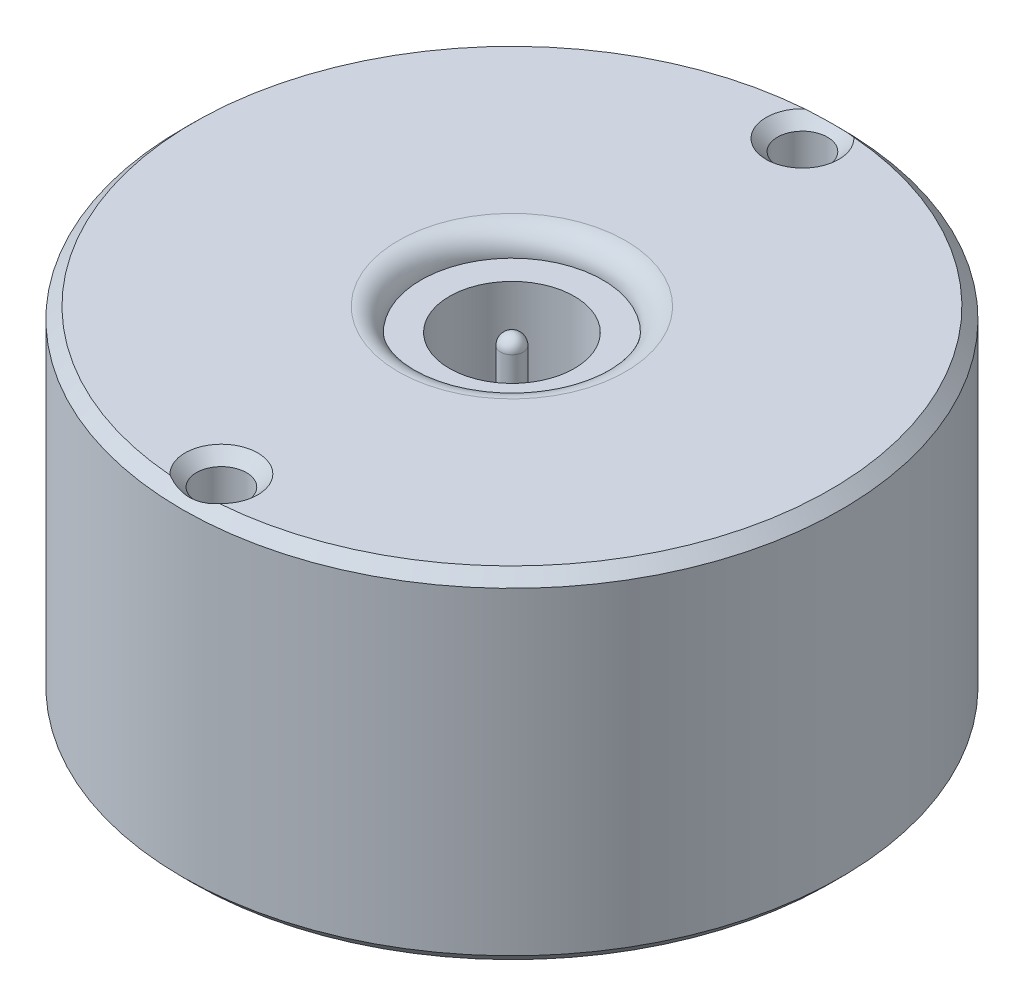
ISO-10303-21;
HEADER;
FILE_DESCRIPTION(('STEP AP214'),'2;1');
FILE_NAME('part.step','',(''),(''),'','','');
FILE_SCHEMA(('AUTOMOTIVE_DESIGN { 1 0 10303 214 1 1 1 1 }'));
ENDSEC;
DATA;
#1=APPLICATION_CONTEXT('core data for automotive mechanical design processes');
#2=APPLICATION_PROTOCOL_DEFINITION('international standard','automotive_design',2000,#1);
#3=PRODUCT_CONTEXT('',#1,'mechanical');
#4=PRODUCT('Part','Part','',(#3));
#5=PRODUCT_RELATED_PRODUCT_CATEGORY('part','',(#4));
#6=PRODUCT_DEFINITION_FORMATION('','',#4);
#7=PRODUCT_DEFINITION_CONTEXT('part definition',#1,'design');
#8=PRODUCT_DEFINITION('design','',#6,#7);
#9=PRODUCT_DEFINITION_SHAPE('','',#8);
#10=(LENGTH_UNIT() NAMED_UNIT(*) SI_UNIT(.MILLI.,.METRE.));
#11=(NAMED_UNIT(*) PLANE_ANGLE_UNIT() SI_UNIT($,.RADIAN.));
#12=(NAMED_UNIT(*) SI_UNIT($,.STERADIAN.) SOLID_ANGLE_UNIT());
#13=UNCERTAINTY_MEASURE_WITH_UNIT(LENGTH_MEASURE(1.E-05),#10,'distance_accuracy_value','');
#14=(GEOMETRIC_REPRESENTATION_CONTEXT(3) GLOBAL_UNCERTAINTY_ASSIGNED_CONTEXT((#13)) GLOBAL_UNIT_ASSIGNED_CONTEXT((#10,
#11,#12)) REPRESENTATION_CONTEXT('',''));
#15=CARTESIAN_POINT('',(0.,0.,0.));
#16=DIRECTION('',(0.,0.,1.));
#17=DIRECTION('',(1.,0.,0.));
#18=AXIS2_PLACEMENT_3D('',#15,#16,#17);
#19=CARTESIAN_POINT('',(0.,15.,0.));
#20=DIRECTION('',(0.,-1.,0.));
#21=DIRECTION('',(0.,0.,-1.));
#22=AXIS2_PLACEMENT_3D('',#19,#20,#21);
#23=CYLINDRICAL_SURFACE('',#22,14.5);
#24=CARTESIAN_POINT('',(0.,0.499999999999992,0.));
#25=DIRECTION('',(0.,1.,0.));
#26=DIRECTION('',(0.,0.,1.));
#27=AXIS2_PLACEMENT_3D('',#24,#25,#26);
#28=CIRCLE('',#27,14.5);
#29=CARTESIAN_POINT('',(0.,0.499999999999992,14.5));
#30=VERTEX_POINT('',#29);
#31=EDGE_CURVE('E90',#30,#30,#28,.T.);
#32=ORIENTED_EDGE('',*,*,#31,.T.);
#33=EDGE_LOOP('',(#32));
#34=FACE_BOUND('',#33,.T.);
#35=CARTESIAN_POINT('',(0.,14.5,0.));
#36=DIRECTION('',(0.,1.,0.));
#37=DIRECTION('',(0.,0.,1.));
#38=AXIS2_PLACEMENT_3D('',#35,#36,#37);
#39=CIRCLE('',#38,14.5);
#40=CARTESIAN_POINT('',(0.,14.5,14.5));
#41=VERTEX_POINT('',#40);
#42=EDGE_CURVE('E82',#41,#41,#39,.F.);
#43=ORIENTED_EDGE('',*,*,#42,.T.);
#44=EDGE_LOOP('',(#43));
#45=FACE_BOUND('',#44,.T.);
#46=ADVANCED_FACE('F37',(#34,#45),#23,.T.);
#47=CARTESIAN_POINT('',(0.,15.,0.));
#48=DIRECTION('',(0.,1.,0.));
#49=DIRECTION('',(0.,0.,1.));
#50=AXIS2_PLACEMENT_3D('',#47,#48,#49);
#51=PLANE('',#50);
#52=CARTESIAN_POINT('',(0.,15.,0.));
#53=DIRECTION('',(0.,1.,0.));
#54=DIRECTION('',(0.,0.,1.));
#55=AXIS2_PLACEMENT_3D('',#52,#53,#54);
#56=CIRCLE('',#55,5.);
#57=CARTESIAN_POINT('',(0.,15.,5.));
#58=VERTEX_POINT('',#57);
#59=EDGE_CURVE('E45',#58,#58,#56,.F.);
#60=ORIENTED_EDGE('',*,*,#59,.T.);
#61=EDGE_LOOP('',(#60));
#62=FACE_BOUND('',#61,.T.);
#63=CARTESIAN_POINT('',(0.,15.,-12.7817252356636));
#64=DIRECTION('',(0.,1.,0.));
#65=DIRECTION('',(0.,0.,1.));
#66=AXIS2_PLACEMENT_3D('',#63,#64,#65);
#67=CIRCLE('',#66,1.6);
#68=CARTESIAN_POINT('',(1.08470031154809,15.,-13.9579162210599));
#69=VERTEX_POINT('',#68);
#70=CARTESIAN_POINT('',(-1.08470031154807,15.,-13.9579162210599));
#71=VERTEX_POINT('',#70);
#72=EDGE_CURVE('E75',#69,#71,#67,.F.);
#73=ORIENTED_EDGE('',*,*,#72,.T.);
#74=CARTESIAN_POINT('',(0.,15.,0.));
#75=DIRECTION('',(0.,1.,0.));
#76=DIRECTION('',(0.,0.,1.));
#77=AXIS2_PLACEMENT_3D('',#74,#75,#76);
#78=CIRCLE('',#77,14.);
#79=CARTESIAN_POINT('',(-1.08470031154807,15.,13.9579162210599));
#80=VERTEX_POINT('',#79);
#81=EDGE_CURVE('E69',#71,#80,#78,.T.);
#82=ORIENTED_EDGE('',*,*,#81,.T.);
#83=CARTESIAN_POINT('',(0.,15.,12.7817252356636));
#84=DIRECTION('',(0.,1.,0.));
#85=DIRECTION('',(0.,0.,1.));
#86=AXIS2_PLACEMENT_3D('',#83,#84,#85);
#87=CIRCLE('',#86,1.6);
#88=CARTESIAN_POINT('',(1.08470031154809,15.,13.9579162210599));
#89=VERTEX_POINT('',#88);
#90=EDGE_CURVE('E74',#80,#89,#87,.F.);
#91=ORIENTED_EDGE('',*,*,#90,.T.);
#92=CARTESIAN_POINT('',(0.,15.,0.));
#93=DIRECTION('',(0.,1.,0.));
#94=DIRECTION('',(0.,0.,1.));
#95=AXIS2_PLACEMENT_3D('',#92,#93,#94);
#96=CIRCLE('',#95,14.);
#97=EDGE_CURVE('E52',#89,#69,#96,.T.);
#98=ORIENTED_EDGE('',*,*,#97,.T.);
#99=EDGE_LOOP('',(#73,#82,#91,#98));
#100=FACE_BOUND('',#99,.T.);
#101=ADVANCED_FACE('F73',(#62,#100),#51,.T.);
#102=CARTESIAN_POINT('',(0.,0.,0.));
#103=DIRECTION('',(0.,1.,0.));
#104=DIRECTION('',(0.,0.,1.));
#105=AXIS2_PLACEMENT_3D('',#102,#103,#104);
#106=PLANE('',#105);
#107=CARTESIAN_POINT('',(0.,0.,0.));
#108=DIRECTION('',(0.,1.,0.));
#109=DIRECTION('',(0.,0.,1.));
#110=AXIS2_PLACEMENT_3D('',#107,#108,#109);
#111=CIRCLE('',#110,14.);
#112=CARTESIAN_POINT('',(0.,0.,14.));
#113=VERTEX_POINT('',#112);
#114=EDGE_CURVE('E93',#113,#113,#111,.F.);
#115=ORIENTED_EDGE('',*,*,#114,.T.);
#116=EDGE_LOOP('',(#115));
#117=FACE_BOUND('',#116,.T.);
#118=CARTESIAN_POINT('',(0.,0.,12.7817252356636));
#119=DIRECTION('',(0.,1.,0.));
#120=DIRECTION('',(0.,0.,1.));
#121=AXIS2_PLACEMENT_3D('',#118,#119,#120);
#122=CIRCLE('',#121,1.1);
#123=CARTESIAN_POINT('',(0.,0.,13.8817252356636));
#124=VERTEX_POINT('',#123);
#125=EDGE_CURVE('E186',#124,#124,#122,.T.);
#126=ORIENTED_EDGE('',*,*,#125,.T.);
#127=EDGE_LOOP('',(#126));
#128=FACE_BOUND('',#127,.T.);
#129=CARTESIAN_POINT('',(0.,0.,-12.7817252356636));
#130=DIRECTION('',(0.,1.,0.));
#131=DIRECTION('',(0.,0.,1.));
#132=AXIS2_PLACEMENT_3D('',#129,#130,#131);
#133=CIRCLE('',#132,1.1);
#134=CARTESIAN_POINT('',(0.,0.,-11.6817252356636));
#135=VERTEX_POINT('',#134);
#136=EDGE_CURVE('E185',#135,#135,#133,.T.);
#137=ORIENTED_EDGE('',*,*,#136,.T.);
#138=EDGE_LOOP('',(#137));
#139=FACE_BOUND('',#138,.T.);
#140=ADVANCED_FACE('F141',(#117,#128,#139),#106,.F.);
#141=CARTESIAN_POINT('',(0.,0.,-12.7817252356636));
#142=DIRECTION('',(0.,1.,0.));
#143=DIRECTION('',(0.,0.,1.));
#144=AXIS2_PLACEMENT_3D('',#141,#142,#143);
#145=CYLINDRICAL_SURFACE('',#144,1.1);
#146=CARTESIAN_POINT('',(0.,14.5,-12.7817252356636));
#147=DIRECTION('',(0.,1.,0.));
#148=DIRECTION('',(0.,0.,1.));
#149=AXIS2_PLACEMENT_3D('',#146,#147,#148);
#150=CIRCLE('',#149,1.1);
#151=CARTESIAN_POINT('',(0.,14.5,-11.6817252356636));
#152=VERTEX_POINT('',#151);
#153=EDGE_CURVE('E79',#152,#152,#150,.T.);
#154=ORIENTED_EDGE('',*,*,#153,.T.);
#155=EDGE_LOOP('',(#154));
#156=FACE_BOUND('',#155,.T.);
#157=ORIENTED_EDGE('',*,*,#136,.F.);
#158=EDGE_LOOP('',(#157));
#159=FACE_BOUND('',#158,.T.);
#160=ADVANCED_FACE('F147',(#156,#159),#145,.F.);
#161=CARTESIAN_POINT('',(0.,0.,12.7817252356636));
#162=DIRECTION('',(0.,1.,0.));
#163=DIRECTION('',(0.,0.,1.));
#164=AXIS2_PLACEMENT_3D('',#161,#162,#163);
#165=CYLINDRICAL_SURFACE('',#164,1.1);
#166=CARTESIAN_POINT('',(0.,14.5,12.7817252356636));
#167=DIRECTION('',(0.,1.,0.));
#168=DIRECTION('',(0.,0.,1.));
#169=AXIS2_PLACEMENT_3D('',#166,#167,#168);
#170=CIRCLE('',#169,1.1);
#171=CARTESIAN_POINT('',(0.,14.5,13.8817252356636));
#172=VERTEX_POINT('',#171);
#173=EDGE_CURVE('E84',#172,#172,#170,.T.);
#174=ORIENTED_EDGE('',*,*,#173,.T.);
#175=EDGE_LOOP('',(#174));
#176=FACE_BOUND('',#175,.T.);
#177=ORIENTED_EDGE('',*,*,#125,.F.);
#178=EDGE_LOOP('',(#177));
#179=FACE_BOUND('',#178,.T.);
#180=ADVANCED_FACE('F152',(#176,#179),#165,.F.);
#181=CARTESIAN_POINT('',(0.,14.5,12.7817252356636));
#182=DIRECTION('',(0.,1.,0.));
#183=DIRECTION('',(0.,0.,1.));
#184=AXIS2_PLACEMENT_3D('',#181,#182,#183);
#185=CONICAL_SURFACE('',#184,1.1,0.785398163397449);
#186=ORIENTED_EDGE('',*,*,#90,.F.);
#187=CARTESIAN_POINT('',(-1.08470031154807,15.,13.9579162210599));
#188=CARTESIAN_POINT('',(-1.02416125532546,14.9783592108917,13.9843286423897));
#189=CARTESIAN_POINT('',(-0.962271910420837,14.9581764011204,14.0089616106969));
#190=CARTESIAN_POINT('',(-0.835952588363377,14.9211236045647,14.0541842715458));
#191=CARTESIAN_POINT('',(-0.771518509255965,14.9042592524171,14.0747670870555));
#192=CARTESIAN_POINT('',(-0.640749891461847,14.8743787438408,14.1112360241023));
#193=CARTESIAN_POINT('',(-0.574424449086455,14.8613467562413,14.1271414674642));
#194=CARTESIAN_POINT('',(-0.440120534754306,14.8394337015012,14.1538861868316));
#195=CARTESIAN_POINT('',(-0.372143167380152,14.8305499367988,14.164728755191));
#196=CARTESIAN_POINT('',(-0.238951145478409,14.817595457663,14.1805395999396));
#197=CARTESIAN_POINT('',(-0.173795273780591,14.8132828220838,14.1858031392845));
#198=CARTESIAN_POINT('',(-0.0431179226886154,14.8087518153545,14.1913331993947));
#199=CARTESIAN_POINT('',(0.0224036068577448,14.8085340203653,14.1915990169601));
#200=CARTESIAN_POINT('',(0.153153474572075,14.8122034693064,14.1871204819881));
#201=CARTESIAN_POINT('',(0.218381846072216,14.8160902340477,14.1823767142973));
#202=CARTESIAN_POINT('',(0.347909826712712,14.8278325396108,14.1680453179229));
#203=CARTESIAN_POINT('',(0.412209588250487,14.8356874214197,14.1584584935594));
#204=CARTESIAN_POINT('',(0.582416585509068,14.8617270511134,14.1266773205135));
#205=CARTESIAN_POINT('',(0.687075751425081,14.8833053515336,14.1003411662584));
#206=CARTESIAN_POINT('',(0.83961680557309,14.9223597281425,14.0526755918465));
#207=CARTESIAN_POINT('',(0.889738478092124,14.9364981598925,14.0354197417068));
#208=CARTESIAN_POINT('',(0.988404501364143,14.9667890981858,13.998449878209));
#209=CARTESIAN_POINT('',(1.03694989461798,14.9829402379176,13.9787375330341));
#210=CARTESIAN_POINT('',(1.08470031154809,15.,13.9579162210599));
#211=B_SPLINE_CURVE_WITH_KNOTS('',3,(#187,#188,#189,#190,#191,#192,#193,#194,#195,#196,#197,
#198,#199,#200,#201,#202,#203,#204,#205,#206,#207,#208,#209,#210),.UNSPECIFIED.,.F.,.F.,(4,2,2,
2,2,2,2,2,2,2,2,4),(0.,0.20853289075824,0.417416864989476,0.625425429246413,0.833298537886614,
1.0295171491943,1.22576336905788,1.42198668058378,1.61817741464837,1.94695530678437,
2.11145376243906,2.27584111131576),.UNSPECIFIED.);
#212=EDGE_CURVE('E66',#80,#89,#211,.T.);
#213=ORIENTED_EDGE('',*,*,#212,.T.);
#214=EDGE_LOOP('',(#186,#213));
#215=FACE_BOUND('',#214,.T.);
#216=ORIENTED_EDGE('',*,*,#173,.F.);
#217=EDGE_LOOP('',(#216));
#218=FACE_BOUND('',#217,.T.);
#219=ADVANCED_FACE('F77',(#215,#218),#185,.F.);
#220=CARTESIAN_POINT('',(0.,14.5,-12.7817252356636));
#221=DIRECTION('',(0.,1.,0.));
#222=DIRECTION('',(0.,0.,1.));
#223=AXIS2_PLACEMENT_3D('',#220,#221,#222);
#224=CONICAL_SURFACE('',#223,1.1,0.785398163397449);
#225=ORIENTED_EDGE('',*,*,#72,.F.);
#226=CARTESIAN_POINT('',(1.08470031154809,15.,-13.9579162210599));
#227=CARTESIAN_POINT('',(1.02416125532548,14.9783592108917,-13.9843286423897));
#228=CARTESIAN_POINT('',(0.962271910420865,14.9581764011204,-14.0089616106969));
#229=CARTESIAN_POINT('',(0.835952588363405,14.9211236045648,-14.0541842715458));
#230=CARTESIAN_POINT('',(0.771518509255993,14.9042592524171,-14.0747670870555));
#231=CARTESIAN_POINT('',(0.640749891461875,14.8743787438408,-14.1112360241023));
#232=CARTESIAN_POINT('',(0.574424449086483,14.8613467562413,-14.1271414674642));
#233=CARTESIAN_POINT('',(0.440120534754335,14.8394337015012,-14.1538861868316));
#234=CARTESIAN_POINT('',(0.372143167380181,14.8305499367988,-14.164728755191));
#235=CARTESIAN_POINT('',(0.238951145478438,14.817595457663,-14.1805395999396));
#236=CARTESIAN_POINT('',(0.17379527378062,14.8132828220838,-14.1858031392845));
#237=CARTESIAN_POINT('',(0.043117922688645,14.8087518153545,-14.1913331993947));
#238=CARTESIAN_POINT('',(-0.022403606857715,14.8085340203653,-14.1915990169601));
#239=CARTESIAN_POINT('',(-0.153153474572045,14.8122034693064,-14.1871204819881));
#240=CARTESIAN_POINT('',(-0.218381846072186,14.8160902340477,-14.1823767142973));
#241=CARTESIAN_POINT('',(-0.347909826712682,14.8278325396108,-14.168045317923));
#242=CARTESIAN_POINT('',(-0.412209588250457,14.8356874214197,-14.1584584935594));
#243=CARTESIAN_POINT('',(-0.582416585509038,14.8617270511134,-14.1266773205135));
#244=CARTESIAN_POINT('',(-0.687075751425052,14.8833053515336,-14.1003411662584));
#245=CARTESIAN_POINT('',(-0.839616805573061,14.9223597281425,-14.0526755918465));
#246=CARTESIAN_POINT('',(-0.889738478092095,14.9364981598925,-14.0354197417068));
#247=CARTESIAN_POINT('',(-0.988404501364115,14.9667890981858,-13.998449878209));
#248=CARTESIAN_POINT('',(-1.03694989461795,14.9829402379176,-13.9787375330341));
#249=CARTESIAN_POINT('',(-1.08470031154807,15.,-13.9579162210599));
#250=B_SPLINE_CURVE_WITH_KNOTS('',3,(#226,#227,#228,#229,#230,#231,#232,#233,#234,#235,#236,
#237,#238,#239,#240,#241,#242,#243,#244,#245,#246,#247,#248,#249),.UNSPECIFIED.,.F.,.F.,(4,2,2,
2,2,2,2,2,2,2,2,4),(0.,0.208532890758239,0.417416864989474,0.625425429246411,0.833298537886612,
1.0295171491943,1.22576336905788,1.42198668058378,1.61817741464836,1.94695530678437,
2.11145376243905,2.27584111131576),.UNSPECIFIED.);
#251=EDGE_CURVE('E58',#69,#71,#250,.T.);
#252=ORIENTED_EDGE('',*,*,#251,.T.);
#253=EDGE_LOOP('',(#225,#252));
#254=FACE_BOUND('',#253,.T.);
#255=ORIENTED_EDGE('',*,*,#153,.F.);
#256=EDGE_LOOP('',(#255));
#257=FACE_BOUND('',#256,.T.);
#258=ADVANCED_FACE('F194',(#254,#257),#224,.F.);
#259=CARTESIAN_POINT('',(0.,0.499999999999992,0.));
#260=DIRECTION('',(0.,1.,0.));
#261=DIRECTION('',(0.,0.,1.));
#262=AXIS2_PLACEMENT_3D('',#259,#260,#261);
#263=CONICAL_SURFACE('',#262,14.5,0.785398163397453);
#264=ORIENTED_EDGE('',*,*,#114,.F.);
#265=EDGE_LOOP('',(#264));
#266=FACE_BOUND('',#265,.T.);
#267=ORIENTED_EDGE('',*,*,#31,.F.);
#268=EDGE_LOOP('',(#267));
#269=FACE_BOUND('',#268,.T.);
#270=ADVANCED_FACE('F119',(#266,#269),#263,.T.);
#271=CARTESIAN_POINT('',(0.,15.,0.));
#272=DIRECTION('',(0.,-1.,0.));
#273=DIRECTION('',(0.,0.,-1.));
#274=AXIS2_PLACEMENT_3D('',#271,#272,#273);
#275=CONICAL_SURFACE('',#274,14.,0.785398163397453);
#276=ORIENTED_EDGE('',*,*,#42,.F.);
#277=EDGE_LOOP('',(#276));
#278=FACE_BOUND('',#277,.T.);
#279=ORIENTED_EDGE('',*,*,#212,.F.);
#280=ORIENTED_EDGE('',*,*,#81,.F.);
#281=ORIENTED_EDGE('',*,*,#251,.F.);
#282=ORIENTED_EDGE('',*,*,#97,.F.);
#283=EDGE_LOOP('',(#279,#280,#281,#282));
#284=FACE_BOUND('',#283,.T.);
#285=ADVANCED_FACE('F68',(#278,#284),#275,.T.);
#286=CARTESIAN_POINT('',(0.,14.,0.));
#287=DIRECTION('',(0.,1.,0.));
#288=DIRECTION('',(0.,0.,1.));
#289=AXIS2_PLACEMENT_3D('',#286,#287,#288);
#290=PLANE('',#289);
#291=CARTESIAN_POINT('',(0.,14.,0.));
#292=DIRECTION('',(0.,1.,0.));
#293=DIRECTION('',(0.,0.,1.));
#294=AXIS2_PLACEMENT_3D('',#291,#292,#293);
#295=CIRCLE('',#294,4.);
#296=CARTESIAN_POINT('',(0.,14.,4.));
#297=VERTEX_POINT('',#296);
#298=EDGE_CURVE('E171',#297,#297,#295,.T.);
#299=ORIENTED_EDGE('',*,*,#298,.T.);
#300=EDGE_LOOP('',(#299));
#301=FACE_BOUND('',#300,.T.);
#302=CARTESIAN_POINT('',(0.,14.,0.));
#303=DIRECTION('',(0.,1.,0.));
#304=DIRECTION('',(0.,0.,1.));
#305=AXIS2_PLACEMENT_3D('',#302,#303,#304);
#306=CIRCLE('',#305,2.75);
#307=CARTESIAN_POINT('',(0.,14.,2.75));
#308=VERTEX_POINT('',#307);
#309=EDGE_CURVE('E174',#308,#308,#306,.F.);
#310=ORIENTED_EDGE('',*,*,#309,.T.);
#311=EDGE_LOOP('',(#310));
#312=FACE_BOUND('',#311,.T.);
#313=ADVANCED_FACE('F118',(#301,#312),#290,.T.);
#314=CARTESIAN_POINT('',(0.,10.,0.));
#315=DIRECTION('',(0.,1.,0.));
#316=DIRECTION('',(0.,0.,1.));
#317=AXIS2_PLACEMENT_3D('',#314,#315,#316);
#318=CYLINDRICAL_SURFACE('',#317,2.75);
#319=CARTESIAN_POINT('',(0.,10.,0.));
#320=DIRECTION('',(0.,1.,0.));
#321=DIRECTION('',(0.,0.,1.));
#322=AXIS2_PLACEMENT_3D('',#319,#320,#321);
#323=CIRCLE('',#322,2.75);
#324=CARTESIAN_POINT('',(0.,10.,2.75));
#325=VERTEX_POINT('',#324);
#326=EDGE_CURVE('E179',#325,#325,#323,.T.);
#327=ORIENTED_EDGE('',*,*,#326,.F.);
#328=EDGE_LOOP('',(#327));
#329=FACE_BOUND('',#328,.T.);
#330=ORIENTED_EDGE('',*,*,#309,.F.);
#331=EDGE_LOOP('',(#330));
#332=FACE_BOUND('',#331,.T.);
#333=ADVANCED_FACE('F157',(#329,#332),#318,.F.);
#334=CARTESIAN_POINT('',(0.,10.,0.));
#335=DIRECTION('',(0.,1.,0.));
#336=DIRECTION('',(0.,0.,1.));
#337=AXIS2_PLACEMENT_3D('',#334,#335,#336);
#338=PLANE('',#337);
#339=CARTESIAN_POINT('',(0.,10.,0.));
#340=DIRECTION('',(0.,1.,0.));
#341=DIRECTION('',(0.,0.,1.));
#342=AXIS2_PLACEMENT_3D('',#339,#340,#341);
#343=CIRCLE('',#342,0.5);
#344=CARTESIAN_POINT('',(0.,10.,0.5));
#345=VERTEX_POINT('',#344);
#346=EDGE_CURVE('E176',#345,#345,#343,.T.);
#347=ORIENTED_EDGE('',*,*,#346,.F.);
#348=EDGE_LOOP('',(#347));
#349=FACE_BOUND('',#348,.T.);
#350=ORIENTED_EDGE('',*,*,#326,.T.);
#351=EDGE_LOOP('',(#350));
#352=FACE_BOUND('',#351,.T.);
#353=ADVANCED_FACE('F131',(#349,#352),#338,.T.);
#354=CARTESIAN_POINT('',(0.,10.,0.));
#355=DIRECTION('',(0.,1.,0.));
#356=DIRECTION('',(0.,0.,1.));
#357=AXIS2_PLACEMENT_3D('',#354,#355,#356);
#358=CYLINDRICAL_SURFACE('',#357,0.5);
#359=CARTESIAN_POINT('',(0.,13.5,0.));
#360=DIRECTION('',(0.,1.,0.));
#361=DIRECTION('',(0.,0.,1.));
#362=AXIS2_PLACEMENT_3D('',#359,#360,#361);
#363=CIRCLE('',#362,0.5);
#364=CARTESIAN_POINT('',(0.,13.5,0.5));
#365=VERTEX_POINT('',#364);
#366=EDGE_CURVE('E11',#365,#365,#363,.F.);
#367=ORIENTED_EDGE('',*,*,#366,.T.);
#368=EDGE_LOOP('',(#367));
#369=FACE_BOUND('',#368,.T.);
#370=ORIENTED_EDGE('',*,*,#346,.T.);
#371=EDGE_LOOP('',(#370));
#372=FACE_BOUND('',#371,.T.);
#373=ADVANCED_FACE('F124',(#369,#372),#358,.T.);
#374=CARTESIAN_POINT('',(0.,14.,0.));
#375=DIRECTION('',(0.,1.,0.));
#376=DIRECTION('',(0.,0.,1.));
#377=AXIS2_PLACEMENT_3D('',#374,#375,#376);
#378=TOROIDAL_SURFACE('',#377,5.,1.);
#379=ORIENTED_EDGE('',*,*,#59,.F.);
#380=EDGE_LOOP('',(#379));
#381=FACE_BOUND('',#380,.T.);
#382=ORIENTED_EDGE('',*,*,#298,.F.);
#383=EDGE_LOOP('',(#382));
#384=FACE_BOUND('',#383,.T.);
#385=ADVANCED_FACE('F121',(#381,#384),#378,.T.);
#386=CARTESIAN_POINT('',(0.,13.5,0.));
#387=DIRECTION('',(0.,1.,0.));
#388=DIRECTION('',(0.,0.,1.));
#389=AXIS2_PLACEMENT_3D('',#386,#387,#388);
#390=SPHERICAL_SURFACE('',#389,0.5);
#391=ORIENTED_EDGE('',*,*,#366,.F.);
#392=EDGE_LOOP('',(#391));
#393=FACE_BOUND('',#392,.T.);
#394=ADVANCED_FACE('F39',(#393),#390,.T.);
#395=CLOSED_SHELL('',(#46,#101,#140,#160,#180,#219,#258,#270,#285,#313,#333,#353,#373,#385,#394));
#396=MANIFOLD_SOLID_BREP('B2',#395);
#397=ADVANCED_BREP_SHAPE_REPRESENTATION('',(#18,#396),#14);
#398=SHAPE_DEFINITION_REPRESENTATION(#9,#397);
ENDSEC;
END-ISO-10303-21;
